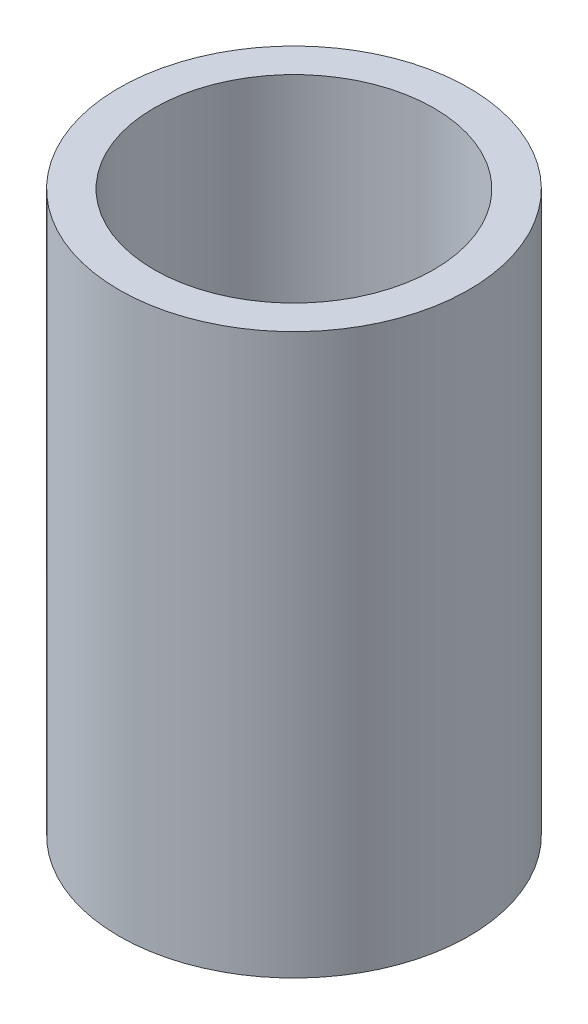
ISO-10303-21;
HEADER;
FILE_DESCRIPTION(('STEP AP214'),'2;1');
FILE_NAME('part.step','',(''),(''),'','','');
FILE_SCHEMA(('AUTOMOTIVE_DESIGN { 1 0 10303 214 1 1 1 1 }'));
ENDSEC;
DATA;
#1=APPLICATION_CONTEXT('core data for automotive mechanical design processes');
#2=APPLICATION_PROTOCOL_DEFINITION('international standard','automotive_design',2000,#1);
#3=PRODUCT_CONTEXT('',#1,'mechanical');
#4=PRODUCT('Part','Part','',(#3));
#5=PRODUCT_RELATED_PRODUCT_CATEGORY('part','',(#4));
#6=PRODUCT_DEFINITION_FORMATION('','',#4);
#7=PRODUCT_DEFINITION_CONTEXT('part definition',#1,'design');
#8=PRODUCT_DEFINITION('design','',#6,#7);
#9=PRODUCT_DEFINITION_SHAPE('','',#8);
#10=(LENGTH_UNIT() NAMED_UNIT(*) SI_UNIT(.MILLI.,.METRE.));
#11=(NAMED_UNIT(*) PLANE_ANGLE_UNIT() SI_UNIT($,.RADIAN.));
#12=(NAMED_UNIT(*) SI_UNIT($,.STERADIAN.) SOLID_ANGLE_UNIT());
#13=UNCERTAINTY_MEASURE_WITH_UNIT(LENGTH_MEASURE(1.E-05),#10,'distance_accuracy_value','');
#14=(GEOMETRIC_REPRESENTATION_CONTEXT(3) GLOBAL_UNCERTAINTY_ASSIGNED_CONTEXT((#13)) GLOBAL_UNIT_ASSIGNED_CONTEXT((#10,
#11,#12)) REPRESENTATION_CONTEXT('',''));
#15=CARTESIAN_POINT('',(0.,0.,0.));
#16=DIRECTION('',(0.,0.,1.));
#17=DIRECTION('',(1.,0.,0.));
#18=AXIS2_PLACEMENT_3D('',#15,#16,#17);
#19=CARTESIAN_POINT('',(0.,24.,0.));
#20=DIRECTION('',(0.,1.,0.));
#21=DIRECTION('',(0.,0.,1.));
#22=AXIS2_PLACEMENT_3D('',#19,#20,#21);
#23=PLANE('',#22);
#24=CARTESIAN_POINT('',(0.,24.,0.));
#25=DIRECTION('',(0.,1.,0.));
#26=DIRECTION('',(0.,0.,1.));
#27=AXIS2_PLACEMENT_3D('',#24,#25,#26);
#28=CIRCLE('',#27,7.5);
#29=CARTESIAN_POINT('',(0.,24.,7.5));
#30=VERTEX_POINT('',#29);
#31=EDGE_CURVE('E10',#30,#30,#28,.T.);
#32=ORIENTED_EDGE('',*,*,#31,.T.);
#33=EDGE_LOOP('',(#32));
#34=FACE_BOUND('',#33,.T.);
#35=CARTESIAN_POINT('',(0.,24.,0.));
#36=DIRECTION('',(0.,1.,0.));
#37=DIRECTION('',(0.,0.,1.));
#38=AXIS2_PLACEMENT_3D('',#35,#36,#37);
#39=CIRCLE('',#38,6.);
#40=CARTESIAN_POINT('',(0.,24.,6.));
#41=VERTEX_POINT('',#40);
#42=EDGE_CURVE('E45',#41,#41,#39,.T.);
#43=ORIENTED_EDGE('',*,*,#42,.F.);
#44=EDGE_LOOP('',(#43));
#45=FACE_BOUND('',#44,.T.);
#46=ADVANCED_FACE('F34',(#34,#45),#23,.T.);
#47=CARTESIAN_POINT('',(0.,0.,0.));
#48=DIRECTION('',(0.,1.,0.));
#49=DIRECTION('',(0.,0.,1.));
#50=AXIS2_PLACEMENT_3D('',#47,#48,#49);
#51=PLANE('',#50);
#52=CARTESIAN_POINT('',(0.,0.,0.));
#53=DIRECTION('',(0.,1.,0.));
#54=DIRECTION('',(0.,0.,1.));
#55=AXIS2_PLACEMENT_3D('',#52,#53,#54);
#56=CIRCLE('',#55,7.5);
#57=CARTESIAN_POINT('',(0.,0.,7.5));
#58=VERTEX_POINT('',#57);
#59=EDGE_CURVE('E38',#58,#58,#56,.T.);
#60=ORIENTED_EDGE('',*,*,#59,.F.);
#61=EDGE_LOOP('',(#60));
#62=FACE_BOUND('',#61,.T.);
#63=CARTESIAN_POINT('',(0.,0.,0.));
#64=DIRECTION('',(0.,1.,0.));
#65=DIRECTION('',(0.,0.,1.));
#66=AXIS2_PLACEMENT_3D('',#63,#64,#65);
#67=CIRCLE('',#66,6.);
#68=CARTESIAN_POINT('',(0.,0.,6.));
#69=VERTEX_POINT('',#68);
#70=EDGE_CURVE('E47',#69,#69,#67,.T.);
#71=ORIENTED_EDGE('',*,*,#70,.T.);
#72=EDGE_LOOP('',(#71));
#73=FACE_BOUND('',#72,.T.);
#74=ADVANCED_FACE('F57',(#62,#73),#51,.F.);
#75=CARTESIAN_POINT('',(0.,24.,0.));
#76=DIRECTION('',(0.,-1.,0.));
#77=DIRECTION('',(0.,0.,-1.));
#78=AXIS2_PLACEMENT_3D('',#75,#76,#77);
#79=CYLINDRICAL_SURFACE('',#78,7.5);
#80=ORIENTED_EDGE('',*,*,#31,.F.);
#81=EDGE_LOOP('',(#80));
#82=FACE_BOUND('',#81,.T.);
#83=ORIENTED_EDGE('',*,*,#59,.T.);
#84=EDGE_LOOP('',(#83));
#85=FACE_BOUND('',#84,.T.);
#86=ADVANCED_FACE('F36',(#82,#85),#79,.T.);
#87=CARTESIAN_POINT('',(0.,24.,0.));
#88=DIRECTION('',(0.,-1.,0.));
#89=DIRECTION('',(0.,0.,-1.));
#90=AXIS2_PLACEMENT_3D('',#87,#88,#89);
#91=CYLINDRICAL_SURFACE('',#90,6.);
#92=ORIENTED_EDGE('',*,*,#42,.T.);
#93=EDGE_LOOP('',(#92));
#94=FACE_BOUND('',#93,.T.);
#95=ORIENTED_EDGE('',*,*,#70,.F.);
#96=EDGE_LOOP('',(#95));
#97=FACE_BOUND('',#96,.T.);
#98=ADVANCED_FACE('F53',(#94,#97),#91,.F.);
#99=CLOSED_SHELL('',(#46,#74,#86,#98));
#100=MANIFOLD_SOLID_BREP('B2',#99);
#101=ADVANCED_BREP_SHAPE_REPRESENTATION('',(#18,#100),#14);
#102=SHAPE_DEFINITION_REPRESENTATION(#9,#101);
ENDSEC;
END-ISO-10303-21;
